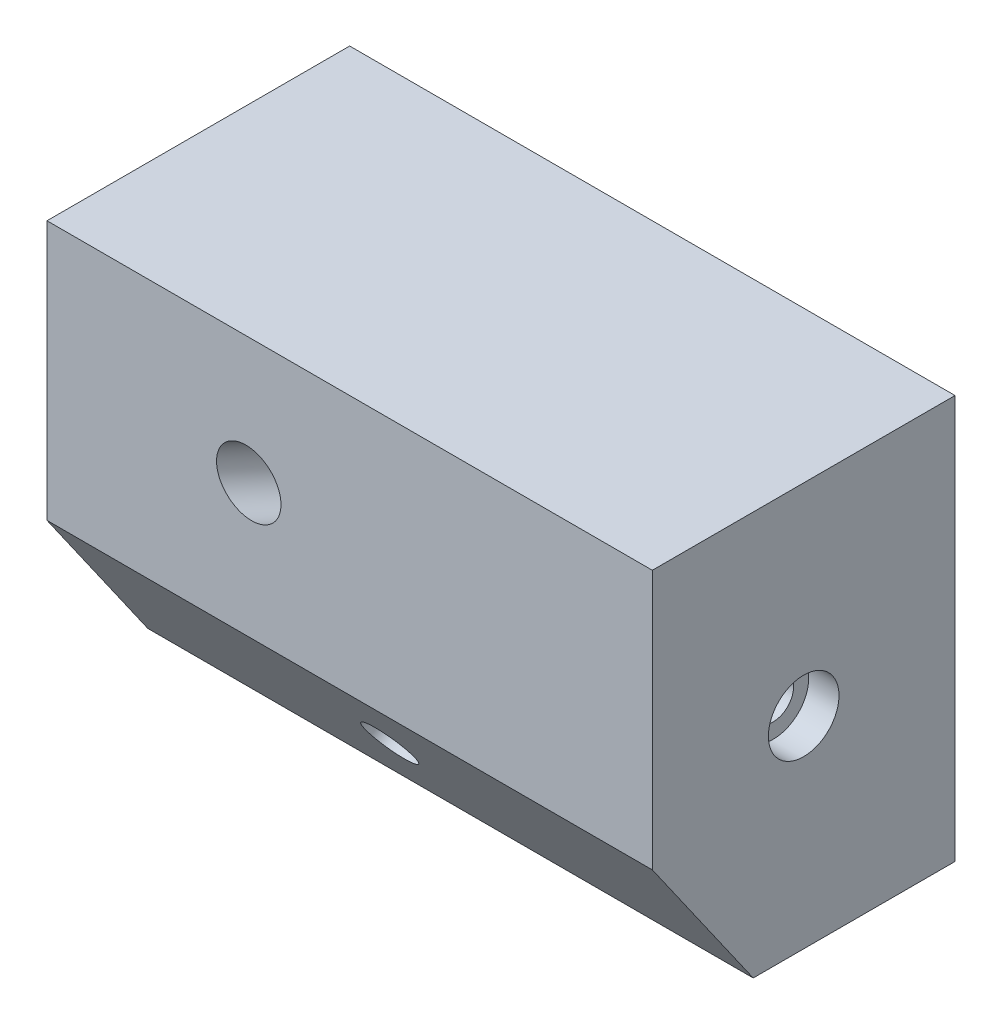
ISO-10303-21;
HEADER;
FILE_DESCRIPTION(('STEP AP214'),'2;1');
FILE_NAME('part.step','',(''),(''),'','','');
FILE_SCHEMA(('AUTOMOTIVE_DESIGN { 1 0 10303 214 1 1 1 1 }'));
ENDSEC;
DATA;
#1=APPLICATION_CONTEXT('core data for automotive mechanical design processes');
#2=APPLICATION_PROTOCOL_DEFINITION('international standard','automotive_design',2000,#1);
#3=PRODUCT_CONTEXT('',#1,'mechanical');
#4=PRODUCT('Part','Part','',(#3));
#5=PRODUCT_RELATED_PRODUCT_CATEGORY('part','',(#4));
#6=PRODUCT_DEFINITION_FORMATION('','',#4);
#7=PRODUCT_DEFINITION_CONTEXT('part definition',#1,'design');
#8=PRODUCT_DEFINITION('design','',#6,#7);
#9=PRODUCT_DEFINITION_SHAPE('','',#8);
#10=(LENGTH_UNIT() NAMED_UNIT(*) SI_UNIT(.MILLI.,.METRE.));
#11=(NAMED_UNIT(*) PLANE_ANGLE_UNIT() SI_UNIT($,.RADIAN.));
#12=(NAMED_UNIT(*) SI_UNIT($,.STERADIAN.) SOLID_ANGLE_UNIT());
#13=UNCERTAINTY_MEASURE_WITH_UNIT(LENGTH_MEASURE(1.E-05),#10,'distance_accuracy_value','');
#14=(GEOMETRIC_REPRESENTATION_CONTEXT(3) GLOBAL_UNCERTAINTY_ASSIGNED_CONTEXT((#13)) GLOBAL_UNIT_ASSIGNED_CONTEXT((#10,
#11,#12)) REPRESENTATION_CONTEXT('',''));
#15=CARTESIAN_POINT('',(0.,0.,0.));
#16=DIRECTION('',(0.,0.,1.));
#17=DIRECTION('',(1.,0.,0.));
#18=AXIS2_PLACEMENT_3D('',#15,#16,#17);
#19=CARTESIAN_POINT('',(0.,80.,60.));
#20=DIRECTION('',(1.,0.,0.));
#21=DIRECTION('',(0.,0.,-1.));
#22=AXIS2_PLACEMENT_3D('',#19,#20,#21);
#23=PLANE('',#22);
#24=DIRECTION('',(0.,0.81915119386013,0.573577650887414));
#25=VECTOR('',#24,1.);
#26=CARTESIAN_POINT('',(0.,28.56287,60.));
#27=LINE('',#26,#25);
#28=CARTESIAN_POINT('',(0.,0.,40.));
#29=VERTEX_POINT('',#28);
#30=CARTESIAN_POINT('',(0.,28.56287,60.));
#31=VERTEX_POINT('',#30);
#32=EDGE_CURVE('E159',#29,#31,#27,.T.);
#33=ORIENTED_EDGE('',*,*,#32,.T.);
#34=DIRECTION('',(0.,-1.,0.));
#35=VECTOR('',#34,1.);
#36=CARTESIAN_POINT('',(0.,80.,60.));
#37=LINE('',#36,#35);
#38=CARTESIAN_POINT('',(0.,80.,60.));
#39=VERTEX_POINT('',#38);
#40=EDGE_CURVE('E124',#39,#31,#37,.T.);
#41=ORIENTED_EDGE('',*,*,#40,.F.);
#42=DIRECTION('',(0.,0.,-1.));
#43=VECTOR('',#42,1.);
#44=CARTESIAN_POINT('',(0.,80.,60.));
#45=LINE('',#44,#43);
#46=CARTESIAN_POINT('',(0.,80.,0.));
#47=VERTEX_POINT('',#46);
#48=EDGE_CURVE('E116',#39,#47,#45,.T.);
#49=ORIENTED_EDGE('',*,*,#48,.T.);
#50=DIRECTION('',(0.,-1.,0.));
#51=VECTOR('',#50,1.);
#52=CARTESIAN_POINT('',(0.,80.,0.));
#53=LINE('',#52,#51);
#54=CARTESIAN_POINT('',(0.,0.,0.));
#55=VERTEX_POINT('',#54);
#56=EDGE_CURVE('E131',#47,#55,#53,.T.);
#57=ORIENTED_EDGE('',*,*,#56,.T.);
#58=DIRECTION('',(0.,0.,-1.));
#59=VECTOR('',#58,1.);
#60=CARTESIAN_POINT('',(0.,0.,60.));
#61=LINE('',#60,#59);
#62=EDGE_CURVE('E12',#29,#55,#61,.T.);
#63=ORIENTED_EDGE('',*,*,#62,.F.);
#64=EDGE_LOOP('',(#33,#41,#49,#57,#63));
#65=FACE_BOUND('',#64,.T.);
#66=ADVANCED_FACE('F63',(#65),#23,.F.);
#67=CARTESIAN_POINT('',(0.,0.,60.));
#68=DIRECTION('',(0.,1.,0.));
#69=DIRECTION('',(0.,0.,1.));
#70=AXIS2_PLACEMENT_3D('',#67,#68,#69);
#71=PLANE('',#70);
#72=DIRECTION('',(-1.,0.,0.));
#73=VECTOR('',#72,1.);
#74=CARTESIAN_POINT('',(120.,0.,40.));
#75=LINE('',#74,#73);
#76=CARTESIAN_POINT('',(120.,0.,40.));
#77=VERTEX_POINT('',#76);
#78=EDGE_CURVE('E145',#77,#29,#75,.T.);
#79=ORIENTED_EDGE('',*,*,#78,.T.);
#80=ORIENTED_EDGE('',*,*,#62,.T.);
#81=DIRECTION('',(1.,0.,0.));
#82=VECTOR('',#81,1.);
#83=CARTESIAN_POINT('',(0.,0.,0.));
#84=LINE('',#83,#82);
#85=CARTESIAN_POINT('',(120.,0.,0.));
#86=VERTEX_POINT('',#85);
#87=EDGE_CURVE('E137',#55,#86,#84,.T.);
#88=ORIENTED_EDGE('',*,*,#87,.T.);
#89=DIRECTION('',(0.,0.,-1.));
#90=VECTOR('',#89,1.);
#91=CARTESIAN_POINT('',(120.,0.,60.));
#92=LINE('',#91,#90);
#93=EDGE_CURVE('E78',#77,#86,#92,.T.);
#94=ORIENTED_EDGE('',*,*,#93,.F.);
#95=EDGE_LOOP('',(#79,#80,#88,#94));
#96=FACE_BOUND('',#95,.T.);
#97=ADVANCED_FACE('F209',(#96),#71,.F.);
#98=CARTESIAN_POINT('',(120.,0.,60.));
#99=DIRECTION('',(-1.,0.,0.));
#100=DIRECTION('',(0.,0.,1.));
#101=AXIS2_PLACEMENT_3D('',#98,#99,#100);
#102=PLANE('',#101);
#103=CARTESIAN_POINT('',(120.,40.,30.));
#104=DIRECTION('',(1.,0.,0.));
#105=DIRECTION('',(0.,0.,-1.));
#106=AXIS2_PLACEMENT_3D('',#103,#104,#105);
#107=CIRCLE('',#106,7.);
#108=CARTESIAN_POINT('',(120.,40.,23.));
#109=VERTEX_POINT('',#108);
#110=EDGE_CURVE('E164',#109,#109,#107,.T.);
#111=ORIENTED_EDGE('',*,*,#110,.F.);
#112=EDGE_LOOP('',(#111));
#113=FACE_BOUND('',#112,.T.);
#114=DIRECTION('',(0.,0.81915119386013,0.573577650887414));
#115=VECTOR('',#114,1.);
#116=CARTESIAN_POINT('',(120.,28.56287,60.));
#117=LINE('',#116,#115);
#118=CARTESIAN_POINT('',(120.,28.56287,60.));
#119=VERTEX_POINT('',#118);
#120=EDGE_CURVE('E86',#77,#119,#117,.T.);
#121=ORIENTED_EDGE('',*,*,#120,.F.);
#122=ORIENTED_EDGE('',*,*,#93,.T.);
#123=DIRECTION('',(0.,1.,0.));
#124=VECTOR('',#123,1.);
#125=CARTESIAN_POINT('',(120.,0.,0.));
#126=LINE('',#125,#124);
#127=CARTESIAN_POINT('',(120.,80.,0.));
#128=VERTEX_POINT('',#127);
#129=EDGE_CURVE('E125',#86,#128,#126,.T.);
#130=ORIENTED_EDGE('',*,*,#129,.T.);
#131=DIRECTION('',(0.,0.,-1.));
#132=VECTOR('',#131,1.);
#133=CARTESIAN_POINT('',(120.,80.,60.));
#134=LINE('',#133,#132);
#135=CARTESIAN_POINT('',(120.,80.,60.));
#136=VERTEX_POINT('',#135);
#137=EDGE_CURVE('E119',#136,#128,#134,.T.);
#138=ORIENTED_EDGE('',*,*,#137,.F.);
#139=DIRECTION('',(0.,1.,0.));
#140=VECTOR('',#139,1.);
#141=CARTESIAN_POINT('',(120.,0.,60.));
#142=LINE('',#141,#140);
#143=EDGE_CURVE('E200',#119,#136,#142,.T.);
#144=ORIENTED_EDGE('',*,*,#143,.F.);
#145=EDGE_LOOP('',(#121,#122,#130,#138,#144));
#146=FACE_BOUND('',#145,.T.);
#147=ADVANCED_FACE('F206',(#113,#146),#102,.F.);
#148=CARTESIAN_POINT('',(0.,0.,60.));
#149=DIRECTION('',(0.,0.,1.));
#150=DIRECTION('',(1.,0.,0.));
#151=AXIS2_PLACEMENT_3D('',#148,#149,#150);
#152=PLANE('',#151);
#153=CARTESIAN_POINT('',(40.0000003036419,55.0000000980999,60.));
#154=DIRECTION('',(0.,0.,1.));
#155=DIRECTION('',(0.80530872119161,-0.592855685283302,0.));
#156=AXIS2_PLACEMENT_3D('',#153,#154,#155);
#157=ELLIPSE('',#156,6.58435719353539,6.);
#158=CARTESIAN_POINT('',(45.3024405750366,51.0964265019764,60.));
#159=VERTEX_POINT('',#158);
#160=EDGE_CURVE('E156',#159,#159,#157,.T.);
#161=ORIENTED_EDGE('',*,*,#160,.F.);
#162=EDGE_LOOP('',(#161));
#163=FACE_BOUND('',#162,.T.);
#164=ORIENTED_EDGE('',*,*,#40,.T.);
#165=DIRECTION('',(-1.,0.,0.));
#166=VECTOR('',#165,1.);
#167=CARTESIAN_POINT('',(120.,28.56287,60.));
#168=LINE('',#167,#166);
#169=EDGE_CURVE('E139',#119,#31,#168,.T.);
#170=ORIENTED_EDGE('',*,*,#169,.F.);
#171=ORIENTED_EDGE('',*,*,#143,.T.);
#172=DIRECTION('',(-1.,0.,0.));
#173=VECTOR('',#172,1.);
#174=CARTESIAN_POINT('',(120.,80.,60.));
#175=LINE('',#174,#173);
#176=EDGE_CURVE('E95',#136,#39,#175,.T.);
#177=ORIENTED_EDGE('',*,*,#176,.T.);
#178=EDGE_LOOP('',(#164,#170,#171,#177));
#179=FACE_BOUND('',#178,.T.);
#180=ADVANCED_FACE('F204',(#163,#179),#152,.T.);
#181=CARTESIAN_POINT('',(120.,80.,60.));
#182=DIRECTION('',(0.,-1.,0.));
#183=DIRECTION('',(0.,0.,-1.));
#184=AXIS2_PLACEMENT_3D('',#181,#182,#183);
#185=PLANE('',#184);
#186=DIRECTION('',(-1.,0.,0.));
#187=VECTOR('',#186,1.);
#188=CARTESIAN_POINT('',(120.,80.,0.));
#189=LINE('',#188,#187);
#190=EDGE_CURVE('E113',#128,#47,#189,.T.);
#191=ORIENTED_EDGE('',*,*,#190,.T.);
#192=ORIENTED_EDGE('',*,*,#48,.F.);
#193=ORIENTED_EDGE('',*,*,#176,.F.);
#194=ORIENTED_EDGE('',*,*,#137,.T.);
#195=EDGE_LOOP('',(#191,#192,#193,#194));
#196=FACE_BOUND('',#195,.T.);
#197=ADVANCED_FACE('F115',(#196),#185,.F.);
#198=CARTESIAN_POINT('',(0.,0.,0.));
#199=DIRECTION('',(0.,0.,1.));
#200=DIRECTION('',(1.,0.,0.));
#201=AXIS2_PLACEMENT_3D('',#198,#199,#200);
#202=PLANE('',#201);
#203=ORIENTED_EDGE('',*,*,#56,.F.);
#204=ORIENTED_EDGE('',*,*,#190,.F.);
#205=ORIENTED_EDGE('',*,*,#129,.F.);
#206=ORIENTED_EDGE('',*,*,#87,.F.);
#207=EDGE_LOOP('',(#203,#204,#205,#206));
#208=FACE_BOUND('',#207,.T.);
#209=ADVANCED_FACE('F135',(#208),#202,.F.);
#210=CARTESIAN_POINT('',(120.,28.56287,60.));
#211=DIRECTION('',(0.,-0.573577650887414,0.81915119386013));
#212=DIRECTION('',(0.,-0.81915119386013,-0.573577650887414));
#213=AXIS2_PLACEMENT_3D('',#210,#211,#212);
#214=PLANE('',#213);
#215=CARTESIAN_POINT('',(57.9403,14.2814652265205,50.0000211649043));
#216=DIRECTION('',(0.,-0.573577650887414,0.81915119386013));
#217=DIRECTION('',(0.,-0.81915119386013,-0.573577650887414));
#218=AXIS2_PLACEMENT_3D('',#215,#216,#217);
#219=CIRCLE('',#218,5.);
#220=CARTESIAN_POINT('',(57.9403,10.1857092572199,47.1321329104672));
#221=VERTEX_POINT('',#220);
#222=EDGE_CURVE('E173',#221,#221,#219,.T.);
#223=ORIENTED_EDGE('',*,*,#222,.F.);
#224=EDGE_LOOP('',(#223));
#225=FACE_BOUND('',#224,.T.);
#226=ORIENTED_EDGE('',*,*,#32,.F.);
#227=ORIENTED_EDGE('',*,*,#78,.F.);
#228=ORIENTED_EDGE('',*,*,#120,.T.);
#229=ORIENTED_EDGE('',*,*,#169,.T.);
#230=EDGE_LOOP('',(#226,#227,#228,#229));
#231=FACE_BOUND('',#230,.T.);
#232=ADVANCED_FACE('F215',(#225,#231),#214,.T.);
#233=CARTESIAN_POINT('',(36.683319,57.441689,69.112507));
#234=DIRECTION('',(0.331668124744669,-0.244168886053008,-0.911250684560504));
#235=DIRECTION('',(-0.939692620915183,0.,-0.342020142970491));
#236=AXIS2_PLACEMENT_3D('',#233,#234,#235);
#237=CYLINDRICAL_SURFACE('',#236,6.);
#238=CARTESIAN_POINT('',(57.9403,39.8426492154852,22.212101141524));
#239=CARTESIAN_POINT('',(57.8040873913017,39.7846901374813,22.2948764621836));
#240=CARTESIAN_POINT('',(57.6636675023803,39.7253244445734,22.3699753960875));
#241=CARTESIAN_POINT('',(57.374556769589,39.6042689750023,22.5002589482916));
#242=CARTESIAN_POINT('',(57.2258610485168,39.5425778349421,22.5554316769264));
#243=CARTESIAN_POINT('',(56.919593585595,39.4171175689329,22.6405810526726));
#244=CARTESIAN_POINT('',(56.7619373405037,39.3533324584214,22.6702503741783));
#245=CARTESIAN_POINT('',(56.5233764926237,39.258338991729,22.6904746465894));
#246=CARTESIAN_POINT('',(56.4435468046827,39.2268026836262,22.6931737240761));
#247=CARTESIAN_POINT('',(56.283830212389,39.1642533853054,22.6899725628963));
#248=CARTESIAN_POINT('',(56.2039433197756,39.1332403088312,22.6840737559089));
#249=CARTESIAN_POINT('',(56.0521457689327,39.0748640270091,22.6642906161808));
#250=CARTESIAN_POINT('',(55.9801642549003,39.0474235154783,22.6511726501121));
#251=CARTESIAN_POINT('',(55.8375299560949,38.9935444935641,22.6175481213425));
#252=CARTESIAN_POINT('',(55.7668776508643,38.9671063414402,22.597038943911));
#253=CARTESIAN_POINT('',(55.6275897402198,38.9154864842971,22.5488629068401));
#254=CARTESIAN_POINT('',(55.5589540158867,38.8903047051271,22.5211964702168));
#255=CARTESIAN_POINT('',(55.4242400977052,38.8413763613716,22.45915077586));
#256=CARTESIAN_POINT('',(55.3581630266279,38.8176304243426,22.4247686102933));
#257=CARTESIAN_POINT('',(55.1795561920052,38.7541176175334,22.3211729789725));
#258=CARTESIAN_POINT('',(55.0701692752249,38.7159948705576,22.2454378649331));
#259=CARTESIAN_POINT('',(54.8621495920171,38.6448639428026,22.0786882349369));
#260=CARTESIAN_POINT('',(54.7635194673792,38.6118570175975,21.9876699794282));
#261=CARTESIAN_POINT('',(54.5125596975437,38.5294978601693,21.7270201536463));
#262=CARTESIAN_POINT('',(54.3700881952963,38.4845653103002,21.5464524041913));
#263=CARTESIAN_POINT('',(54.1769430536802,38.4255816108724,21.2604840041547));
#264=CARTESIAN_POINT('',(54.1158970558266,38.4072975993841,21.1624514533148));
#265=CARTESIAN_POINT('',(54.0000704517419,38.3731936200581,20.9623260557073));
#266=CARTESIAN_POINT('',(53.9452886199992,38.3573731700331,20.8602340084187));
#267=CARTESIAN_POINT('',(53.8004476603942,38.3162355832634,20.5709843364624));
#268=CARTESIAN_POINT('',(53.7167034363515,38.2932879826527,20.3803325634077));
#269=CARTESIAN_POINT('',(53.5648575042509,38.2527135679354,19.9923101701925));
#270=CARTESIAN_POINT('',(53.4967694090913,38.2350913800875,19.7949338730039));
#271=CARTESIAN_POINT('',(53.3739560966273,38.2038426867678,19.3949486994023));
#272=CARTESIAN_POINT('',(53.3192847208889,38.1902322379583,19.1923222349607));
#273=CARTESIAN_POINT('',(53.2220369546765,38.1659913138556,18.7839767565998));
#274=CARTESIAN_POINT('',(53.1794647047204,38.1553618587234,18.5782567093036));
#275=CARTESIAN_POINT('',(53.1097518229104,38.1372537575414,18.1896740951338));
#276=CARTESIAN_POINT('',(53.0813704520757,38.1295498510555,18.0070411559318));
#277=CARTESIAN_POINT('',(53.0325484243733,38.1150263205257,17.6406803150905));
#278=CARTESIAN_POINT('',(53.0121080769083,38.1082067309438,17.45695237107));
#279=CARTESIAN_POINT('',(52.9788023850268,38.0947623704173,17.0885084906696));
#280=CARTESIAN_POINT('',(52.965949358623,38.0881379327736,16.9037914362846));
#281=CARTESIAN_POINT('',(52.9477323919744,38.0743443487698,16.5340085831073));
#282=CARTESIAN_POINT('',(52.9423684363852,38.0671752035257,16.3489427850302));
#283=CARTESIAN_POINT('',(52.9392201050548,38.0514532034251,15.9796636401722));
#284=CARTESIAN_POINT('',(52.9414005838546,38.0429069409913,15.7954503329702));
#285=CARTESIAN_POINT('',(52.95360408233,38.0233498223362,15.427364862362));
#286=CARTESIAN_POINT('',(52.9636286144436,38.0123384911092,15.243492771601));
#287=CARTESIAN_POINT('',(52.9921583505258,37.986542675021,14.8770760454155));
#288=CARTESIAN_POINT('',(53.0106442981608,37.9717667911322,14.6945293468312));
#289=CARTESIAN_POINT('',(53.0571758340017,37.9367195067779,14.3312296253096));
#290=CARTESIAN_POINT('',(53.0852158655453,37.9164513020499,14.150475622483));
#291=CARTESIAN_POINT('',(53.13979862568,37.8773282512982,13.8599376828434));
#292=CARTESIAN_POINT('',(53.1628907617166,37.8608422896915,13.7491876147789));
#293=CARTESIAN_POINT('',(53.2139705400543,37.8242466378801,13.5293984884736));
#294=CARTESIAN_POINT('',(53.2419586112617,37.8041366301877,13.4203595810509));
#295=CARTESIAN_POINT('',(53.3034067959845,37.7596537616424,13.2049569309823));
#296=CARTESIAN_POINT('',(53.3368544715356,37.7352905817128,13.0985877273997));
#297=CARTESIAN_POINT('',(53.4099402780513,37.6816401727137,12.8893154218578));
#298=CARTESIAN_POINT('',(53.4495769408265,37.6523541113543,12.7864115048623));
#299=CARTESIAN_POINT('',(53.5625964416731,37.5683277028176,12.5228503784757));
#300=CARTESIAN_POINT('',(53.6416780470237,37.5090544678052,12.3658857885859));
#301=CARTESIAN_POINT('',(53.7754199920967,37.4091307783371,12.1448130300403));
#302=CARTESIAN_POINT('',(53.8225168966848,37.3739899691872,12.0735220988992));
#303=CARTESIAN_POINT('',(53.9217961950293,37.3003785734694,11.9364260619316));
#304=CARTESIAN_POINT('',(53.9739764725035,37.261909373299,11.8706186942087));
#305=CARTESIAN_POINT('',(54.0834118657481,37.1821037549094,11.7449479615538));
#306=CARTESIAN_POINT('',(54.14067806054,37.140761122062,11.6850982068537));
#307=CARTESIAN_POINT('',(54.2598864848277,37.056049321726,11.5718447640134));
#308=CARTESIAN_POINT('',(54.321828798592,37.0126801177221,11.5184411920849));
#309=CARTESIAN_POINT('',(54.450094374304,36.9247034257848,11.4180557202058));
#310=CARTESIAN_POINT('',(54.5164247020744,36.8800940112097,11.3710845707198));
#311=CARTESIAN_POINT('',(54.6529493766867,36.7905629132083,11.2834681818425));
#312=CARTESIAN_POINT('',(54.723144748701,36.7456411497215,11.2428246318448));
#313=CARTESIAN_POINT('',(54.8877704516767,36.6433737282434,11.1566263026611));
#314=CARTESIAN_POINT('',(54.9833396646389,36.5861913261973,11.1130493075138));
#315=CARTESIAN_POINT('',(55.1793749276751,36.4741336785048,11.0348719732326));
#316=CARTESIAN_POINT('',(55.2798424674614,36.4192591443134,11.0002743854617));
#317=CARTESIAN_POINT('',(55.4850476147864,36.3129837182572,10.939042448956));
#318=CARTESIAN_POINT('',(55.5897886137843,36.2615856748499,10.9124145704518));
#319=CARTESIAN_POINT('',(55.8029039186282,36.1632605388715,10.8662366296048));
#320=CARTESIAN_POINT('',(55.9112796027063,36.1163351688038,10.8466892860468));
#321=CARTESIAN_POINT('',(56.1337431232905,36.0266922258351,10.8134977464001));
#322=CARTESIAN_POINT('',(56.2479056874259,35.9841034544948,10.8000073164369));
#323=CARTESIAN_POINT('',(56.4789366785701,35.9051391433293,10.7789160389325));
#324=CARTESIAN_POINT('',(56.5958061173605,35.8687659707745,10.7713174314679));
#325=CARTESIAN_POINT('',(56.8316140873003,35.8028459279147,10.761430176369));
#326=CARTESIAN_POINT('',(56.9505515837739,35.7732957439733,10.7591389462622));
#327=CARTESIAN_POINT('',(57.1900000747422,35.7214815606018,10.7593701569925));
#328=CARTESIAN_POINT('',(57.3105111333695,35.6992178591119,10.7618927946372));
#329=CARTESIAN_POINT('',(57.5717932381843,35.6594503268587,10.7720942554143));
#330=CARTESIAN_POINT('',(57.7127385637522,35.6432664385135,10.7805292381162));
#331=CARTESIAN_POINT('',(57.9950440557404,35.6217292568377,10.8027793567158));
#332=CARTESIAN_POINT('',(58.1364042616204,35.6163770295061,10.8165950219943));
#333=CARTESIAN_POINT('',(58.4185444909443,35.6168616414546,10.849150096879));
#334=CARTESIAN_POINT('',(58.5593245062197,35.6226986377302,10.8678895755679));
#335=CARTESIAN_POINT('',(58.8393299635783,35.6457792261976,10.9099009175257));
#336=CARTESIAN_POINT('',(58.9785547162535,35.6630276875113,10.9331747125356));
#337=CARTESIAN_POINT('',(59.2517298545453,35.7085603509108,10.9834128004368));
#338=CARTESIAN_POINT('',(59.3857301916726,35.7366306541586,11.0102993568777));
#339=CARTESIAN_POINT('',(59.6500883303312,35.803702401931,11.0677651362381));
#340=CARTESIAN_POINT('',(59.7804478088685,35.8426987193967,11.098342623358));
#341=CARTESIAN_POINT('',(60.036608276002,35.9313877331636,11.1629245864126));
#342=CARTESIAN_POINT('',(60.162408995412,35.9810810599046,11.1969292642697));
#343=CARTESIAN_POINT('',(60.4084938532693,36.0907748637874,11.2681180630798));
#344=CARTESIAN_POINT('',(60.5287780852067,36.1507751661707,11.3053021301198));
#345=CARTESIAN_POINT('',(60.7596496519884,36.278734000546,11.3815546598731));
#346=CARTESIAN_POINT('',(60.8704144378606,36.3464217381649,11.4205408833602));
#347=CARTESIAN_POINT('',(61.0851785022041,36.4904675982133,11.5011848499323));
#348=CARTESIAN_POINT('',(61.1891755943128,36.5668285009267,11.542843447805));
#349=CARTESIAN_POINT('',(61.3896531320377,36.727482769907,11.628709220962));
#350=CARTESIAN_POINT('',(61.4861361882711,36.8117733584707,11.6729155017276));
#351=CARTESIAN_POINT('',(61.6710320587824,36.9875354589082,11.763860534329));
#352=CARTESIAN_POINT('',(61.7594445805372,37.0790072308465,11.8105993778617));
#353=CARTESIAN_POINT('',(61.9292181144352,37.2700136059852,11.9075397055916));
#354=CARTESIAN_POINT('',(62.0104200839696,37.3696653052649,11.9577889703288));
#355=CARTESIAN_POINT('',(62.1634081477664,37.5745176144436,12.0611063735081));
#356=CARTESIAN_POINT('',(62.2351971412929,37.6797165017047,12.1141736368774));
#357=CARTESIAN_POINT('',(62.3690908112955,37.8948193105452,12.2235276439992));
#358=CARTESIAN_POINT('',(62.4311781350725,38.0047312245941,12.2798199158746));
#359=CARTESIAN_POINT('',(62.5451402797149,38.2279072582125,12.3959880827814));
#360=CARTESIAN_POINT('',(62.5970150855748,38.3411713827072,12.4558639830781));
#361=CARTESIAN_POINT('',(62.6918796136687,38.5738269871415,12.5820635854253));
#362=CARTESIAN_POINT('',(62.7344840080234,38.6932925430797,12.6485415090113));
#363=CARTESIAN_POINT('',(62.808009503752,38.9326978536865,12.7869987645945));
#364=CARTESIAN_POINT('',(62.8389277908175,39.0526377155617,12.8589794167754));
#365=CARTESIAN_POINT('',(62.8886661368965,39.29050120223,13.0093989316571));
#366=CARTESIAN_POINT('',(62.9075208756482,39.4084296493224,13.0878185438813));
#367=CARTESIAN_POINT('',(62.933022520107,39.6399553495047,13.2525966573807));
#368=CARTESIAN_POINT('',(62.939678918152,39.7535559029459,13.3389489307256));
#369=CARTESIAN_POINT('',(62.9406279826947,39.9333252983286,13.4877225112924));
#370=CARTESIAN_POINT('',(62.9385339861716,40.0017315948501,13.5474397939935));
#371=CARTESIAN_POINT('',(62.9295327640551,40.1346015869427,13.6707586166973));
#372=CARTESIAN_POINT('',(62.9226270780404,40.1990665364373,13.7343589083308));
#373=CARTESIAN_POINT('',(62.9042283495531,40.323065036024,13.8653763920773));
#374=CARTESIAN_POINT('',(62.8927432442237,40.3826069044333,13.9327868078062));
#375=CARTESIAN_POINT('',(62.86551819838,40.4960985652868,14.0713590756783));
#376=CARTESIAN_POINT('',(62.8497781856359,40.5500482627787,14.1425209914891));
#377=CARTESIAN_POINT('',(62.8144795970234,40.6517935161909,14.2882527586541));
#378=CARTESIAN_POINT('',(62.7949198401648,40.6995871611764,14.3628236585241));
#379=CARTESIAN_POINT('',(62.7524956741181,40.7887369943054,14.5148328282779));
#380=CARTESIAN_POINT('',(62.7296299342129,40.8300905762194,14.5922722434094));
#381=CARTESIAN_POINT('',(62.6568283234152,40.9445223912092,14.8281509165391));
#382=CARTESIAN_POINT('',(62.6027075257243,41.0079185403274,14.9900735587197));
#383=CARTESIAN_POINT('',(62.4989906821449,41.1010072581351,15.2844531051021));
#384=CARTESIAN_POINT('',(62.4507487162614,41.1349479781608,15.4161305714204));
#385=CARTESIAN_POINT('',(62.3507330155279,41.1906782877792,15.6807872567982));
#386=CARTESIAN_POINT('',(62.298956783822,41.2124591849854,15.8137673381053));
#387=CARTESIAN_POINT('',(62.1924616501131,41.2460296089973,16.0802815155047));
#388=CARTESIAN_POINT('',(62.1377332416192,41.25778452184,16.2138159442762));
#389=CARTESIAN_POINT('',(62.0258544837995,41.2730479701875,16.4803744256147));
#390=CARTESIAN_POINT('',(61.9687031121098,41.2765529886939,16.6133982363838));
#391=CARTESIAN_POINT('',(61.846325610093,41.2768006979095,16.8917390462403));
#392=CARTESIAN_POINT('',(61.7808644054587,41.2728301394997,17.0369513470199));
#393=CARTESIAN_POINT('',(61.647290712738,41.2582020509776,17.3257728204834));
#394=CARTESIAN_POINT('',(61.5791784837582,41.2475451728429,17.4693821480825));
#395=CARTESIAN_POINT('',(61.4401441450668,41.2206520420066,17.7548992575598));
#396=CARTESIAN_POINT('',(61.3692189273885,41.2044094568516,17.896804918221));
#397=CARTESIAN_POINT('',(61.2244825526967,41.1671843187421,18.1785209505714));
#398=CARTESIAN_POINT('',(61.1506710814208,41.1462012484367,18.3183310917899));
#399=CARTESIAN_POINT('',(60.9998380412447,41.1000759250078,18.5958603066895));
#400=CARTESIAN_POINT('',(60.9228106644413,41.0749258797454,18.7335749248323));
#401=CARTESIAN_POINT('',(60.7654417130089,41.0209573339778,19.0063838651034));
#402=CARTESIAN_POINT('',(60.6850998320691,40.9921384939042,19.1414779433502));
#403=CARTESIAN_POINT('',(60.520916868206,40.931203479789,19.4085986478692));
#404=CARTESIAN_POINT('',(60.4370789370715,40.899090239167,19.5406278768666));
#405=CARTESIAN_POINT('',(60.2655393846462,40.8317929147548,19.8013513787732));
#406=CARTESIAN_POINT('',(60.1778377577995,40.7966088265487,19.9300456468863));
#407=CARTESIAN_POINT('',(59.9637321513237,40.7092729229965,20.2323386917784));
#408=CARTESIAN_POINT('',(59.8353997535592,40.6557940103502,20.4042018853066));
#409=CARTESIAN_POINT('',(59.5695675661912,40.5435431947545,20.7390575042186));
#410=CARTESIAN_POINT('',(59.4320637711892,40.4847689752178,20.9020459965881));
#411=CARTESIAN_POINT('',(59.1475653358757,40.3624455374454,21.215732249733));
#412=CARTESIAN_POINT('',(59.0006335129843,40.2989275386561,21.3664987408172));
#413=CARTESIAN_POINT('',(58.6952546168888,40.1668963062695,21.6533349606259));
#414=CARTESIAN_POINT('',(58.5368223557605,40.0983894976943,21.7894230517302));
#415=CARTESIAN_POINT('',(58.3023984747327,39.997514364687,21.9688891435062));
#416=CARTESIAN_POINT('',(58.2317108368788,39.9671557087395,22.0203726889266));
#417=CARTESIAN_POINT('',(58.0878688753764,39.9055549174272,22.1193707562276));
#418=CARTESIAN_POINT('',(58.0147122439229,39.8743119601547,22.1668814117899));
#419=CARTESIAN_POINT('',(57.9403,39.8426492154852,22.212101141524));
#420=B_SPLINE_CURVE_WITH_KNOTS('',3,(#238,#239,#240,#241,#242,#243,#244,#245,#246,#247,#248,
#249,#250,#251,#252,#253,#254,#255,#256,#257,#258,#259,#260,#261,#262,#263,#264,#265,#266,#267,
#268,#269,#270,#271,#272,#273,#274,#275,#276,#277,#278,#279,#280,#281,#282,#283,#284,#285,#286,
#287,#288,#289,#290,#291,#292,#293,#294,#295,#296,#297,#298,#299,#300,#301,#302,#303,#304,#305,
#306,#307,#308,#309,#310,#311,#312,#313,#314,#315,#316,#317,#318,#319,#320,#321,#322,#323,#324,
#325,#326,#327,#328,#329,#330,#331,#332,#333,#334,#335,#336,#337,#338,#339,#340,#341,#342,#343,
#344,#345,#346,#347,#348,#349,#350,#351,#352,#353,#354,#355,#356,#357,#358,#359,#360,#361,#362,
#363,#364,#365,#366,#367,#368,#369,#370,#371,#372,#373,#374,#375,#376,#377,#378,#379,#380,#381,
#382,#383,#384,#385,#386,#387,#388,#389,#390,#391,#392,#393,#394,#395,#396,#397,#398,#399,#400,
#401,#402,#403,#404,#405,#406,#407,#408,#409,#410,#411,#412,#413,#414,#415,#416,#417,#418,#419),
.UNSPECIFIED.,.T.,.F.,(4,2,2,2,2,2,2,2,2,2,2,2,2,2,2,2,2,2,2,2,2,2,2,2,2,2,2,2,2,2,2,2,2,2,2,2,
2,2,2,2,2,2,2,2,2,2,2,2,2,2,2,2,2,2,2,2,2,2,2,2,2,2,2,2,2,2,2,2,2,2,2,2,2,2,2,2,2,2,2,2,2,2,2,2,
2,2,2,2,2,2,4),(0.,0.508640896981989,1.01758479282247,1.53257896239397,1.78984280191457,
2.04706380796381,2.28113807879347,2.51529523765136,2.74943856025725,2.98368348986269,
3.39716523082978,3.81074829230468,4.50946768002114,4.86009275348274,5.21064911341556,
5.83810825867747,6.46611092961443,7.0965940237902,7.72729262045981,8.2820665115029,
8.83686201579527,9.39255577069421,9.94824838702693,10.5013558227575,11.0545699312614,
11.6065312574166,12.1581721088532,12.5010100837001,12.8438781077667,13.1859756477771,
13.5279921562672,14.0817813959679,14.3586388712885,14.6353815753966,14.9127426514049,
15.1901087269279,15.4679328480434,15.7458310181476,16.1040797269789,16.4624380768587,
16.8210865766886,17.1798726448065,17.5473131603393,17.914893308705,18.2822945617022,
18.6497108356569,19.0755548101058,19.5014406919944,19.9273325495143,20.3534062467837,
20.771457702976,21.1893133151075,21.6071935607573,22.0250667217989,22.4312053455287,
22.8374745311298,23.2436019301781,23.6497440437996,24.0633340098139,24.4767962863994,
24.8909898316708,25.3051839855185,25.7342311717342,26.1633816175589,26.5912927513896,
27.0188707575604,27.2911011200643,27.5632444179995,27.8349180678241,28.1065963297778,
28.3783587227009,28.6502308109582,29.1942581958162,29.6265376544937,30.0591257315305,
30.4932013101985,30.9274619054004,31.4052629484114,31.8830174086714,32.3613152891462,
32.839665393691,33.3189203112039,33.7982196188503,34.2770957905306,34.7559726508579,
35.4187575143737,36.0818337537123,36.7408767039776,37.3990854016113,37.6766862097681,
37.9545541021539),.UNSPECIFIED.);
#421=CARTESIAN_POINT('',(57.9403,39.8426492154852,22.212101141524));
#422=VERTEX_POINT('',#421);
#423=EDGE_CURVE('E67',#422,#422,#420,.T.);
#424=ORIENTED_EDGE('',*,*,#423,.T.);
#425=EDGE_LOOP('',(#424));
#426=FACE_BOUND('',#425,.T.);
#427=ORIENTED_EDGE('',*,*,#160,.T.);
#428=EDGE_LOOP('',(#427));
#429=FACE_BOUND('',#428,.T.);
#430=CARTESIAN_POINT('',(58.926443,41.066649,8.00002600000001));
#431=DIRECTION('',(-0.331668124744669,0.244168886053009,0.911250684560505));
#432=DIRECTION('',(-0.939692620915183,0.,-0.342020142970491));
#433=AXIS2_PLACEMENT_3D('',#430,#431,#432);
#434=CIRCLE('',#433,6.);
#435=CARTESIAN_POINT('',(53.2882872745089,41.066649,5.94790514217706));
#436=VERTEX_POINT('',#435);
#437=EDGE_CURVE('E184',#436,#436,#434,.T.);
#438=ORIENTED_EDGE('',*,*,#437,.F.);
#439=EDGE_LOOP('',(#438));
#440=FACE_BOUND('',#439,.T.);
#441=ADVANCED_FACE('F217',(#426,#429,#440),#237,.F.);
#442=CARTESIAN_POINT('',(58.926443,41.066649,8.00002600000001));
#443=DIRECTION('',(-0.331668124744669,0.244168886053009,0.911250684560505));
#444=DIRECTION('',(-0.939692620915183,0.,-0.342020142970491));
#445=AXIS2_PLACEMENT_3D('',#442,#443,#444);
#446=CONICAL_SURFACE('',#445,6.,1.02974425867665);
#447=CARTESIAN_POINT('',(60.121164456901,40.1871137492136,4.7175557707662));
#448=DIRECTION('',(0.331668124744669,-0.244168886053009,-0.911250684560505));
#449=DIRECTION('',(-0.939692620915183,0.,-0.342020142970491));
#450=AXIS2_PLACEMENT_3D('',#447,#448,#449);
#451=CIRCLE('',#450,0.00500000000000409);
#452=CARTESIAN_POINT('',(60.1164659937964,40.1871137492136,4.71584567005135));
#453=VERTEX_POINT('',#452);
#454=EDGE_CURVE('E160',#453,#453,#451,.F.);
#455=CARTESIAN_POINT('',(53.2882872745089,41.066649,5.94790514217706));
#456=CARTESIAN_POINT('',(53.3594141361682,41.057487174471,5.93507118934242));
#457=CARTESIAN_POINT('',(53.4305409978274,41.048325348942,5.92223723650778));
#458=CARTESIAN_POINT('',(53.5727947211459,41.0300016978839,5.89656933083849));
#459=CARTESIAN_POINT('',(53.6439215828051,41.0208398723549,5.88373537800385));
#460=CARTESIAN_POINT('',(53.7861753061236,41.0025162212968,5.85806747233456));
#461=CARTESIAN_POINT('',(53.8573021677829,40.9933543957678,5.84523351949992));
#462=CARTESIAN_POINT('',(53.9995558911014,40.9750307447098,5.81956561383063));
#463=CARTESIAN_POINT('',(54.0706827527606,40.9658689191807,5.80673166099599));
#464=CARTESIAN_POINT('',(54.2129364760791,40.9475452681227,5.7810637553267));
#465=CARTESIAN_POINT('',(54.2840633377383,40.9383834425937,5.76822980249206));
#466=CARTESIAN_POINT('',(54.4263170610568,40.9200597915356,5.74256189682278));
#467=CARTESIAN_POINT('',(54.4974439227161,40.9108979660066,5.72972794398813));
#468=CARTESIAN_POINT('',(54.6396976460346,40.8925743149485,5.70406003831885));
#469=CARTESIAN_POINT('',(54.7108245076938,40.8834124894195,5.6912260854842));
#470=CARTESIAN_POINT('',(54.8530782310123,40.8650888383615,5.66555817981492));
#471=CARTESIAN_POINT('',(54.9242050926715,40.8559270128324,5.65272422698028));
#472=CARTESIAN_POINT('',(55.06645881599,40.8376033617744,5.62705632131099));
#473=CARTESIAN_POINT('',(55.1375856776493,40.8284415362454,5.61422236847635));
#474=CARTESIAN_POINT('',(55.2798394009678,40.8101178851873,5.58855446280706));
#475=CARTESIAN_POINT('',(55.350966262627,40.8009560596583,5.57572050997242));
#476=CARTESIAN_POINT('',(55.4932199859455,40.7826324086002,5.55005260430313));
#477=CARTESIAN_POINT('',(55.5643468476048,40.7734705830712,5.53721865146849));
#478=CARTESIAN_POINT('',(55.7066005709232,40.7551469320132,5.5115507457992));
#479=CARTESIAN_POINT('',(55.7777274325825,40.7459851064841,5.49871679296456));
#480=CARTESIAN_POINT('',(55.919981155901,40.7276614554261,5.47304888729528));
#481=CARTESIAN_POINT('',(55.9911080175602,40.7184996298971,5.46021493446063));
#482=CARTESIAN_POINT('',(56.1333617408787,40.700175978839,5.43454702879135));
#483=CARTESIAN_POINT('',(56.204488602538,40.69101415331,5.4217130759567));
#484=CARTESIAN_POINT('',(56.3467423258565,40.6726905022519,5.39604517028742));
#485=CARTESIAN_POINT('',(56.4178691875157,40.6635286767229,5.38321121745278));
#486=CARTESIAN_POINT('',(56.5601229108342,40.6452050256649,5.35754331178349));
#487=CARTESIAN_POINT('',(56.6312497724934,40.6360432001359,5.34470935894885));
#488=CARTESIAN_POINT('',(56.7735034958119,40.6177195490778,5.31904145327956));
#489=CARTESIAN_POINT('',(56.8446303574712,40.6085577235488,5.30620750044492));
#490=CARTESIAN_POINT('',(56.9868840807897,40.5902340724907,5.28053959477563));
#491=CARTESIAN_POINT('',(57.0580109424489,40.5810722469617,5.26770564194099));
#492=CARTESIAN_POINT('',(57.2002646657674,40.5627485959036,5.2420377362717));
#493=CARTESIAN_POINT('',(57.2713915274266,40.5535867703746,5.22920378343706));
#494=CARTESIAN_POINT('',(57.4136452507451,40.5352631193166,5.20353587776778));
#495=CARTESIAN_POINT('',(57.4847721124044,40.5261012937876,5.19070192493313));
#496=CARTESIAN_POINT('',(57.6270258357229,40.5077776427295,5.16503401926385));
#497=CARTESIAN_POINT('',(57.6981526973821,40.4986158172005,5.1522000664292));
#498=CARTESIAN_POINT('',(57.8404064207006,40.4802921661424,5.12653216075992));
#499=CARTESIAN_POINT('',(57.9115332823599,40.4711303406134,5.11369820792528));
#500=CARTESIAN_POINT('',(58.0537870056783,40.4528066895554,5.08803030225599));
#501=CARTESIAN_POINT('',(58.1249138673376,40.4436448640263,5.07519634942135));
#502=CARTESIAN_POINT('',(58.2671675906561,40.4253212129683,5.04952844375206));
#503=CARTESIAN_POINT('',(58.3382944523153,40.4161593874393,5.03669449091742));
#504=CARTESIAN_POINT('',(58.4805481756338,40.3978357363812,5.01102658524813));
#505=CARTESIAN_POINT('',(58.551675037293,40.3886739108522,4.99819263241349));
#506=CARTESIAN_POINT('',(58.6939287606115,40.3703502597941,4.9725247267442));
#507=CARTESIAN_POINT('',(58.7650556222708,40.3611884342651,4.95969077390956));
#508=CARTESIAN_POINT('',(58.9073093455893,40.3428647832071,4.93402286824028));
#509=CARTESIAN_POINT('',(58.9784362072485,40.333702957678,4.92118891540563));
#510=CARTESIAN_POINT('',(59.120689930567,40.31537930662,4.89552100973635));
#511=CARTESIAN_POINT('',(59.1918167922263,40.306217481091,4.88268705690171));
#512=CARTESIAN_POINT('',(59.3340705155447,40.2878938300329,4.85701915123242));
#513=CARTESIAN_POINT('',(59.405197377204,40.2787320045039,4.84418519839778));
#514=CARTESIAN_POINT('',(59.5474511005225,40.2604083534458,4.81851729272849));
#515=CARTESIAN_POINT('',(59.6185779621817,40.2512465279168,4.80568333989385));
#516=CARTESIAN_POINT('',(59.7608316855002,40.2329228768588,4.78001543422456));
#517=CARTESIAN_POINT('',(59.8319585471595,40.2237610513297,4.76718148138992));
#518=CARTESIAN_POINT('',(59.974212270478,40.2054374002717,4.74151357572063));
#519=CARTESIAN_POINT('',(60.0453391321372,40.1962755747427,4.72867962288599));
#520=CARTESIAN_POINT('',(60.1164659937964,40.1871137492136,4.71584567005135));
#521=B_SPLINE_CURVE_WITH_KNOTS('',3,(#455,#456,#457,#458,#459,#460,#461,#462,#463,#464,#465,
#466,#467,#468,#469,#470,#471,#472,#473,#474,#475,#476,#477,#478,#479,#480,#481,#482,#483,#484,
#485,#486,#487,#488,#489,#490,#491,#492,#493,#494,#495,#496,#497,#498,#499,#500,#501,#502,#503,
#504,#505,#506,#507,#508,#509,#510,#511,#512,#513,#514,#515,#516,#517,#518,#519,#520),
.UNSPECIFIED.,.F.,.F.,(4,2,2,2,2,2,2,2,2,2,2,2,2,2,2,2,2,2,2,2,2,2,2,2,2,2,2,2,2,2,2,2,4),(0.,
0.218561475509563,0.437122951019126,0.655684426528682,0.874245902038245,1.0928073775478,
1.31136885305736,1.52993032856692,1.74849180407648,1.96705327958604,2.1856147550956,
2.40417623060516,2.62273770611472,2.84129918162428,3.05986065713384,3.27842213264339,
3.49698360815296,3.71554508366252,3.93410655917208,4.15266803468164,4.3712295101912,
4.58979098570076,4.80835246121031,5.02691393671987,5.24547541222943,5.46403688773899,
5.68259836324855,5.90115983875811,6.11972131426767,6.33828278977723,6.55684426528679,
6.77540574079635,6.99396721630591),.UNSPECIFIED.);
#522=EDGE_CURVE('BSEAM223',#436,#453,#521,.T.);
#523=ORIENTED_EDGE('',*,*,#437,.T.);
#524=ORIENTED_EDGE('',*,*,#454,.F.);
#525=ORIENTED_EDGE('',*,*,#522,.T.);
#526=ORIENTED_EDGE('',*,*,#522,.F.);
#527=EDGE_LOOP('',(#523,#525,#524,#526));
#528=FACE_BOUND('',#527,.T.);
#529=ADVANCED_FACE('F223',(#528),#446,.F.);
#530=CARTESIAN_POINT('',(60.121164456901,40.1871137492136,4.7175557707662));
#531=DIRECTION('',(0.331668124744669,-0.244168886053009,-0.911250684560505));
#532=DIRECTION('',(-0.939692620915183,0.,-0.342020142970491));
#533=AXIS2_PLACEMENT_3D('',#530,#531,#532);
#534=PLANE('',#533);
#535=ORIENTED_EDGE('',*,*,#454,.T.);
#536=EDGE_LOOP('',(#535));
#537=FACE_BOUND('',#536,.T.);
#538=ADVANCED_FACE('F253',(#537),#534,.F.);
#539=CARTESIAN_POINT('',(114.,40.,30.));
#540=DIRECTION('',(1.,0.,0.));
#541=DIRECTION('',(0.,0.,-1.));
#542=AXIS2_PLACEMENT_3D('',#539,#540,#541);
#543=CYLINDRICAL_SURFACE('',#542,7.);
#544=CARTESIAN_POINT('',(114.,40.,30.));
#545=DIRECTION('',(1.,0.,0.));
#546=DIRECTION('',(0.,0.,-1.));
#547=AXIS2_PLACEMENT_3D('',#544,#545,#546);
#548=CIRCLE('',#547,7.);
#549=CARTESIAN_POINT('',(114.,40.,23.));
#550=VERTEX_POINT('',#549);
#551=EDGE_CURVE('E170',#550,#550,#548,.T.);
#552=ORIENTED_EDGE('',*,*,#551,.F.);
#553=EDGE_LOOP('',(#552));
#554=FACE_BOUND('',#553,.T.);
#555=ORIENTED_EDGE('',*,*,#110,.T.);
#556=EDGE_LOOP('',(#555));
#557=FACE_BOUND('',#556,.T.);
#558=ADVANCED_FACE('F258',(#554,#557),#543,.F.);
#559=CARTESIAN_POINT('',(114.,40.,30.));
#560=DIRECTION('',(1.,0.,0.));
#561=DIRECTION('',(0.,0.,-1.));
#562=AXIS2_PLACEMENT_3D('',#559,#560,#561);
#563=PLANE('',#562);
#564=CARTESIAN_POINT('',(114.,40.,30.));
#565=DIRECTION('',(1.,0.,0.));
#566=DIRECTION('',(0.,0.,-1.));
#567=AXIS2_PLACEMENT_3D('',#564,#565,#566);
#568=CIRCLE('',#567,4.);
#569=CARTESIAN_POINT('',(114.,40.,26.));
#570=VERTEX_POINT('',#569);
#571=EDGE_CURVE('E161',#570,#570,#568,.T.);
#572=ORIENTED_EDGE('',*,*,#571,.F.);
#573=EDGE_LOOP('',(#572));
#574=FACE_BOUND('',#573,.T.);
#575=ORIENTED_EDGE('',*,*,#551,.T.);
#576=EDGE_LOOP('',(#575));
#577=FACE_BOUND('',#576,.T.);
#578=ADVANCED_FACE('F262',(#574,#577),#563,.T.);
#579=CARTESIAN_POINT('',(70.,40.,30.));
#580=DIRECTION('',(1.,0.,0.));
#581=DIRECTION('',(0.,0.,-1.));
#582=AXIS2_PLACEMENT_3D('',#579,#580,#581);
#583=CYLINDRICAL_SURFACE('',#582,4.);
#584=ORIENTED_EDGE('',*,*,#571,.T.);
#585=EDGE_LOOP('',(#584));
#586=FACE_BOUND('',#585,.T.);
#587=CARTESIAN_POINT('',(70.,40.,30.));
#588=DIRECTION('',(1.,0.,0.));
#589=DIRECTION('',(0.,0.,-1.));
#590=AXIS2_PLACEMENT_3D('',#587,#588,#589);
#591=CIRCLE('',#590,4.);
#592=CARTESIAN_POINT('',(70.,40.,26.));
#593=VERTEX_POINT('',#592);
#594=EDGE_CURVE('E165',#593,#593,#591,.T.);
#595=ORIENTED_EDGE('',*,*,#594,.F.);
#596=EDGE_LOOP('',(#595));
#597=FACE_BOUND('',#596,.T.);
#598=ADVANCED_FACE('F275',(#586,#597),#583,.F.);
#599=CARTESIAN_POINT('',(70.,40.,30.));
#600=DIRECTION('',(1.,0.,0.));
#601=DIRECTION('',(0.,0.,-1.));
#602=AXIS2_PLACEMENT_3D('',#599,#600,#601);
#603=PLANE('',#602);
#604=ORIENTED_EDGE('',*,*,#594,.T.);
#605=EDGE_LOOP('',(#604));
#606=FACE_BOUND('',#605,.T.);
#607=ADVANCED_FACE('F280',(#606),#603,.T.);
#608=CARTESIAN_POINT('',(57.9403,8.545716,58.19152));
#609=DIRECTION('',(0.,0.573576435878015,-0.819152044620212));
#610=DIRECTION('',(0.,0.819152044620212,0.573576435878015));
#611=AXIS2_PLACEMENT_3D('',#608,#609,#610);
#612=CYLINDRICAL_SURFACE('',#611,5.);
#613=ORIENTED_EDGE('',*,*,#222,.T.);
#614=EDGE_LOOP('',(#613));
#615=FACE_BOUND('',#614,.T.);
#616=ORIENTED_EDGE('',*,*,#423,.F.);
#617=EDGE_LOOP('',(#616));
#618=FACE_BOUND('',#617,.T.);
#619=ADVANCED_FACE('F283',(#615,#618),#612,.F.);
#620=CLOSED_SHELL('',(#66,#97,#147,#180,#197,#209,#232,#441,#529,#538,#558,#578,#598,#607,#619));
#621=MANIFOLD_SOLID_BREP('B2',#620);
#622=ADVANCED_BREP_SHAPE_REPRESENTATION('',(#18,#621),#14);
#623=SHAPE_DEFINITION_REPRESENTATION(#9,#622);
ENDSEC;
END-ISO-10303-21;
